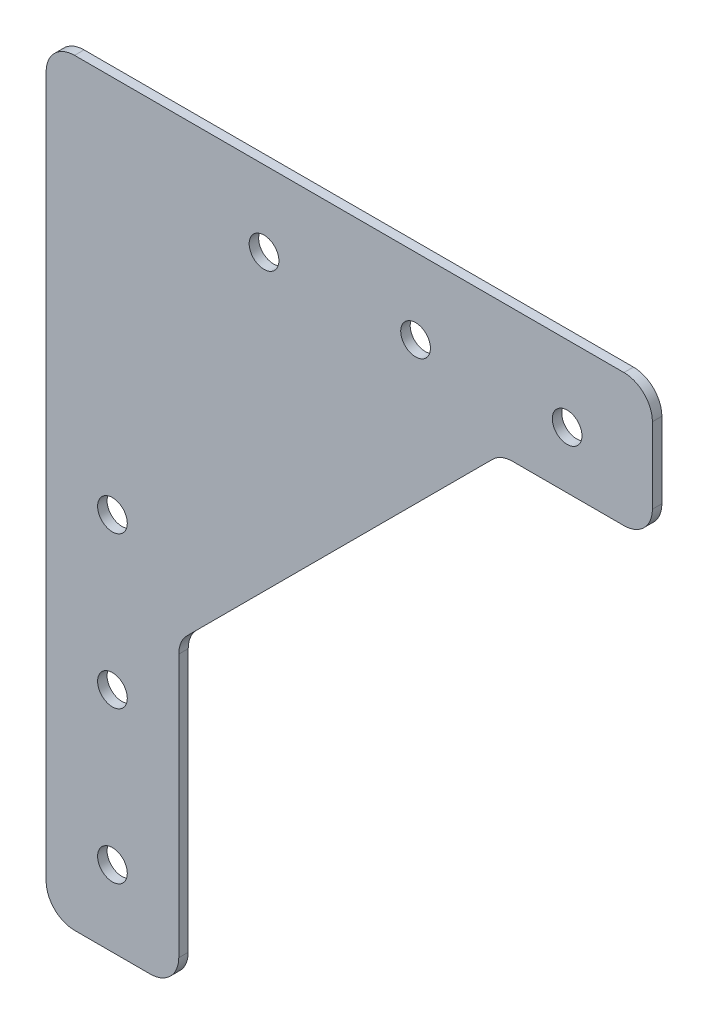
ISO-10303-21;
HEADER;
FILE_DESCRIPTION(('STEP AP214'),'2;1');
FILE_NAME('part.step','',(''),(''),'','','');
FILE_SCHEMA(('AUTOMOTIVE_DESIGN { 1 0 10303 214 1 1 1 1 }'));
ENDSEC;
DATA;
#1=APPLICATION_CONTEXT('core data for automotive mechanical design processes');
#2=APPLICATION_PROTOCOL_DEFINITION('international standard','automotive_design',2000,#1);
#3=PRODUCT_CONTEXT('',#1,'mechanical');
#4=PRODUCT('Part','Part','',(#3));
#5=PRODUCT_RELATED_PRODUCT_CATEGORY('part','',(#4));
#6=PRODUCT_DEFINITION_FORMATION('','',#4);
#7=PRODUCT_DEFINITION_CONTEXT('part definition',#1,'design');
#8=PRODUCT_DEFINITION('design','',#6,#7);
#9=PRODUCT_DEFINITION_SHAPE('','',#8);
#10=(LENGTH_UNIT() NAMED_UNIT(*) SI_UNIT(.MILLI.,.METRE.));
#11=(NAMED_UNIT(*) PLANE_ANGLE_UNIT() SI_UNIT($,.RADIAN.));
#12=(NAMED_UNIT(*) SI_UNIT($,.STERADIAN.) SOLID_ANGLE_UNIT());
#13=UNCERTAINTY_MEASURE_WITH_UNIT(LENGTH_MEASURE(1.E-05),#10,'distance_accuracy_value','');
#14=(GEOMETRIC_REPRESENTATION_CONTEXT(3) GLOBAL_UNCERTAINTY_ASSIGNED_CONTEXT((#13)) GLOBAL_UNIT_ASSIGNED_CONTEXT((#10,
#11,#12)) REPRESENTATION_CONTEXT('',''));
#15=CARTESIAN_POINT('',(0.,0.,0.));
#16=DIRECTION('',(0.,0.,1.));
#17=DIRECTION('',(1.,0.,0.));
#18=AXIS2_PLACEMENT_3D('',#15,#16,#17);
#19=CARTESIAN_POINT('',(0.,0.,0.79375));
#20=DIRECTION('',(0.,0.,-1.));
#21=DIRECTION('',(-1.,0.,0.));
#22=AXIS2_PLACEMENT_3D('',#19,#20,#21);
#23=PLANE('',#22);
#24=DIRECTION('',(0.,1.,0.));
#25=VECTOR('',#24,1.);
#26=CARTESIAN_POINT('',(0.,0.,0.79375));
#27=LINE('',#26,#25);
#28=CARTESIAN_POINT('',(0.,4.7625,0.79375));
#29=VERTEX_POINT('',#28);
#30=CARTESIAN_POINT('',(0.,122.2375,0.79375));
#31=VERTEX_POINT('',#30);
#32=EDGE_CURVE('E423',#29,#31,#27,.T.);
#33=ORIENTED_EDGE('',*,*,#32,.F.);
#34=CARTESIAN_POINT('',(4.7625,4.7625,0.79375));
#35=DIRECTION('',(0.,0.,-1.));
#36=DIRECTION('',(-1.,0.,0.));
#37=AXIS2_PLACEMENT_3D('',#34,#35,#36);
#38=CIRCLE('',#37,4.7625);
#39=CARTESIAN_POINT('',(4.7625,0.,0.79375));
#40=VERTEX_POINT('',#39);
#41=EDGE_CURVE('E340',#29,#40,#38,.F.);
#42=ORIENTED_EDGE('',*,*,#41,.T.);
#43=DIRECTION('',(-1.,0.,0.));
#44=VECTOR('',#43,1.);
#45=CARTESIAN_POINT('',(22.225,0.,0.79375));
#46=LINE('',#45,#44);
#47=CARTESIAN_POINT('',(17.4625,0.,0.79375));
#48=VERTEX_POINT('',#47);
#49=EDGE_CURVE('E377',#48,#40,#46,.T.);
#50=ORIENTED_EDGE('',*,*,#49,.F.);
#51=CARTESIAN_POINT('',(17.4625,4.7625,0.79375));
#52=DIRECTION('',(0.,0.,-1.));
#53=DIRECTION('',(-1.,0.,0.));
#54=AXIS2_PLACEMENT_3D('',#51,#52,#53);
#55=CIRCLE('',#54,4.7625);
#56=CARTESIAN_POINT('',(22.225,4.7625,0.79375));
#57=VERTEX_POINT('',#56);
#58=EDGE_CURVE('E313',#48,#57,#55,.F.);
#59=ORIENTED_EDGE('',*,*,#58,.T.);
#60=DIRECTION('',(0.,1.,0.));
#61=VECTOR('',#60,1.);
#62=CARTESIAN_POINT('',(22.225,0.,0.79375));
#63=LINE('',#62,#61);
#64=CARTESIAN_POINT('',(22.225,48.8273079091979,0.79375));
#65=VERTEX_POINT('',#64);
#66=EDGE_CURVE('E314',#57,#65,#63,.T.);
#67=ORIENTED_EDGE('',*,*,#66,.T.);
#68=CARTESIAN_POINT('',(26.9875,48.8273079091979,0.79375));
#69=DIRECTION('',(0.,0.,-1.));
#70=DIRECTION('',(-1.,0.,0.));
#71=AXIS2_PLACEMENT_3D('',#68,#69,#70);
#72=CIRCLE('',#71,4.7625);
#73=CARTESIAN_POINT('',(23.6199039545991,52.1949039545989,0.79375));
#74=VERTEX_POINT('',#73);
#75=EDGE_CURVE('E12',#65,#74,#72,.T.);
#76=ORIENTED_EDGE('',*,*,#75,.T.);
#77=DIRECTION('',(0.707106781186546,0.707106781186549,0.));
#78=VECTOR('',#77,1.);
#79=CARTESIAN_POINT('',(22.225,50.7999999999998,0.79375));
#80=LINE('',#79,#78);
#81=CARTESIAN_POINT('',(74.8050960454009,103.380096045401,0.79375));
#82=VERTEX_POINT('',#81);
#83=EDGE_CURVE('E318',#74,#82,#80,.T.);
#84=ORIENTED_EDGE('',*,*,#83,.T.);
#85=CARTESIAN_POINT('',(78.1726920908019,100.0125,0.79375));
#86=DIRECTION('',(0.,0.,-1.));
#87=DIRECTION('',(-1.,0.,0.));
#88=AXIS2_PLACEMENT_3D('',#85,#86,#87);
#89=CIRCLE('',#88,4.7625);
#90=CARTESIAN_POINT('',(78.1726920908019,104.775,0.79375));
#91=VERTEX_POINT('',#90);
#92=EDGE_CURVE('E367',#82,#91,#89,.T.);
#93=ORIENTED_EDGE('',*,*,#92,.T.);
#94=DIRECTION('',(1.,0.,0.));
#95=VECTOR('',#94,1.);
#96=CARTESIAN_POINT('',(76.2,104.775,0.79375));
#97=LINE('',#96,#95);
#98=CARTESIAN_POINT('',(96.8375,104.775,0.79375));
#99=VERTEX_POINT('',#98);
#100=EDGE_CURVE('E388',#91,#99,#97,.T.);
#101=ORIENTED_EDGE('',*,*,#100,.T.);
#102=CARTESIAN_POINT('',(96.8375,109.5375,0.79375));
#103=DIRECTION('',(0.,0.,-1.));
#104=DIRECTION('',(-1.,0.,0.));
#105=AXIS2_PLACEMENT_3D('',#102,#103,#104);
#106=CIRCLE('',#105,4.7625);
#107=CARTESIAN_POINT('',(101.6,109.5375,0.79375));
#108=VERTEX_POINT('',#107);
#109=EDGE_CURVE('E336',#99,#108,#106,.F.);
#110=ORIENTED_EDGE('',*,*,#109,.T.);
#111=DIRECTION('',(0.,-1.,0.));
#112=VECTOR('',#111,1.);
#113=CARTESIAN_POINT('',(101.6,127.,0.79375));
#114=LINE('',#113,#112);
#115=CARTESIAN_POINT('',(101.6,122.2375,0.79375));
#116=VERTEX_POINT('',#115);
#117=EDGE_CURVE('E391',#116,#108,#114,.T.);
#118=ORIENTED_EDGE('',*,*,#117,.F.);
#119=CARTESIAN_POINT('',(96.8375,122.2375,0.79375));
#120=DIRECTION('',(0.,0.,-1.));
#121=DIRECTION('',(-1.,0.,0.));
#122=AXIS2_PLACEMENT_3D('',#119,#120,#121);
#123=CIRCLE('',#122,4.7625);
#124=CARTESIAN_POINT('',(96.8375,127.,0.79375));
#125=VERTEX_POINT('',#124);
#126=EDGE_CURVE('E199',#116,#125,#123,.F.);
#127=ORIENTED_EDGE('',*,*,#126,.T.);
#128=DIRECTION('',(1.,0.,0.));
#129=VECTOR('',#128,1.);
#130=CARTESIAN_POINT('',(0.,127.,0.79375));
#131=LINE('',#130,#129);
#132=CARTESIAN_POINT('',(4.7625,127.,0.79375));
#133=VERTEX_POINT('',#132);
#134=EDGE_CURVE('E422',#133,#125,#131,.T.);
#135=ORIENTED_EDGE('',*,*,#134,.F.);
#136=CARTESIAN_POINT('',(4.7625,122.2375,0.79375));
#137=DIRECTION('',(0.,0.,-1.));
#138=DIRECTION('',(-1.,0.,0.));
#139=AXIS2_PLACEMENT_3D('',#136,#137,#138);
#140=CIRCLE('',#139,4.7625);
#141=EDGE_CURVE('E338',#133,#31,#140,.F.);
#142=ORIENTED_EDGE('',*,*,#141,.T.);
#143=EDGE_LOOP('',(#33,#42,#50,#59,#67,#76,#84,#93,#101,#110,#118,#127,#135,#142));
#144=FACE_BOUND('',#143,.T.);
#145=CARTESIAN_POINT('',(11.1124999999995,63.5,0.79375));
#146=DIRECTION('',(0.,0.,1.));
#147=DIRECTION('',(1.,0.,0.));
#148=AXIS2_PLACEMENT_3D('',#145,#146,#147);
#149=CIRCLE('',#148,2.48919999999999);
#150=CARTESIAN_POINT('',(13.6016999999995,63.5,0.79375));
#151=VERTEX_POINT('',#150);
#152=EDGE_CURVE('E309',#151,#151,#149,.T.);
#153=ORIENTED_EDGE('',*,*,#152,.F.);
#154=EDGE_LOOP('',(#153));
#155=FACE_BOUND('',#154,.T.);
#156=CARTESIAN_POINT('',(11.1125,12.7,0.79375));
#157=DIRECTION('',(0.,0.,1.));
#158=DIRECTION('',(1.,0.,0.));
#159=AXIS2_PLACEMENT_3D('',#156,#157,#158);
#160=CIRCLE('',#159,2.4892);
#161=CARTESIAN_POINT('',(13.6017,12.7,0.79375));
#162=VERTEX_POINT('',#161);
#163=EDGE_CURVE('E432',#162,#162,#160,.T.);
#164=ORIENTED_EDGE('',*,*,#163,.F.);
#165=EDGE_LOOP('',(#164));
#166=FACE_BOUND('',#165,.T.);
#167=CARTESIAN_POINT('',(87.3125,114.3,0.79375));
#168=DIRECTION('',(0.,0.,1.));
#169=DIRECTION('',(1.,0.,0.));
#170=AXIS2_PLACEMENT_3D('',#167,#168,#169);
#171=CIRCLE('',#170,2.48920000000001);
#172=CARTESIAN_POINT('',(89.8017,114.3,0.79375));
#173=VERTEX_POINT('',#172);
#174=EDGE_CURVE('E438',#173,#173,#171,.T.);
#175=ORIENTED_EDGE('',*,*,#174,.F.);
#176=EDGE_LOOP('',(#175));
#177=FACE_BOUND('',#176,.T.);
#178=CARTESIAN_POINT('',(11.1124999999997,38.1,0.79375));
#179=DIRECTION('',(0.,0.,1.));
#180=DIRECTION('',(1.,0.,0.));
#181=AXIS2_PLACEMENT_3D('',#178,#179,#180);
#182=CIRCLE('',#181,2.4892);
#183=CARTESIAN_POINT('',(13.6016999999997,38.1,0.79375));
#184=VERTEX_POINT('',#183);
#185=EDGE_CURVE('E444',#184,#184,#182,.T.);
#186=ORIENTED_EDGE('',*,*,#185,.F.);
#187=EDGE_LOOP('',(#186));
#188=FACE_BOUND('',#187,.T.);
#189=CARTESIAN_POINT('',(61.9125,114.3,0.79375));
#190=DIRECTION('',(0.,0.,1.));
#191=DIRECTION('',(1.,0.,0.));
#192=AXIS2_PLACEMENT_3D('',#189,#190,#191);
#193=CIRCLE('',#192,2.4892);
#194=CARTESIAN_POINT('',(64.4017,114.3,0.79375));
#195=VERTEX_POINT('',#194);
#196=EDGE_CURVE('E450',#195,#195,#193,.T.);
#197=ORIENTED_EDGE('',*,*,#196,.F.);
#198=EDGE_LOOP('',(#197));
#199=FACE_BOUND('',#198,.T.);
#200=CARTESIAN_POINT('',(36.5125,114.3,0.79375));
#201=DIRECTION('',(0.,0.,1.));
#202=DIRECTION('',(1.,0.,0.));
#203=AXIS2_PLACEMENT_3D('',#200,#201,#202);
#204=CIRCLE('',#203,2.4892);
#205=CARTESIAN_POINT('',(39.0017,114.3,0.79375));
#206=VERTEX_POINT('',#205);
#207=EDGE_CURVE('E456',#206,#206,#204,.T.);
#208=ORIENTED_EDGE('',*,*,#207,.F.);
#209=EDGE_LOOP('',(#208));
#210=FACE_BOUND('',#209,.T.);
#211=ADVANCED_FACE('F184',(#144,#155,#166,#177,#188,#199,#210),#23,.F.);
#212=CARTESIAN_POINT('',(0.,0.,-0.79375));
#213=DIRECTION('',(0.,0.,-1.));
#214=DIRECTION('',(-1.,0.,0.));
#215=AXIS2_PLACEMENT_3D('',#212,#213,#214);
#216=PLANE('',#215);
#217=CARTESIAN_POINT('',(61.9125,114.3,-0.79375));
#218=DIRECTION('',(0.,0.,1.));
#219=DIRECTION('',(1.,0.,0.));
#220=AXIS2_PLACEMENT_3D('',#217,#218,#219);
#221=CIRCLE('',#220,2.4892);
#222=CARTESIAN_POINT('',(64.4017,114.3,-0.79375));
#223=VERTEX_POINT('',#222);
#224=EDGE_CURVE('E453',#223,#223,#221,.T.);
#225=ORIENTED_EDGE('',*,*,#224,.T.);
#226=EDGE_LOOP('',(#225));
#227=FACE_BOUND('',#226,.T.);
#228=CARTESIAN_POINT('',(87.3125,114.3,-0.79375));
#229=DIRECTION('',(0.,0.,1.));
#230=DIRECTION('',(1.,0.,0.));
#231=AXIS2_PLACEMENT_3D('',#228,#229,#230);
#232=CIRCLE('',#231,2.48920000000001);
#233=CARTESIAN_POINT('',(89.8017,114.3,-0.79375));
#234=VERTEX_POINT('',#233);
#235=EDGE_CURVE('E441',#234,#234,#232,.T.);
#236=ORIENTED_EDGE('',*,*,#235,.T.);
#237=EDGE_LOOP('',(#236));
#238=FACE_BOUND('',#237,.T.);
#239=CARTESIAN_POINT('',(11.1124999999995,63.5,-0.79375));
#240=DIRECTION('',(0.,0.,1.));
#241=DIRECTION('',(1.,0.,0.));
#242=AXIS2_PLACEMENT_3D('',#239,#240,#241);
#243=CIRCLE('',#242,2.48919999999999);
#244=CARTESIAN_POINT('',(13.6016999999995,63.5,-0.79375));
#245=VERTEX_POINT('',#244);
#246=EDGE_CURVE('E429',#245,#245,#243,.T.);
#247=ORIENTED_EDGE('',*,*,#246,.T.);
#248=EDGE_LOOP('',(#247));
#249=FACE_BOUND('',#248,.T.);
#250=DIRECTION('',(-1.,0.,0.));
#251=VECTOR('',#250,1.);
#252=CARTESIAN_POINT('',(22.225,0.,-0.79375));
#253=LINE('',#252,#251);
#254=CARTESIAN_POINT('',(17.4625,0.,-0.79375));
#255=VERTEX_POINT('',#254);
#256=CARTESIAN_POINT('',(4.7625,0.,-0.79375));
#257=VERTEX_POINT('',#256);
#258=EDGE_CURVE('E290',#255,#257,#253,.T.);
#259=ORIENTED_EDGE('',*,*,#258,.T.);
#260=CARTESIAN_POINT('',(4.7625,4.7625,-0.79375));
#261=DIRECTION('',(0.,0.,-1.));
#262=DIRECTION('',(-1.,0.,0.));
#263=AXIS2_PLACEMENT_3D('',#260,#261,#262);
#264=CIRCLE('',#263,4.7625);
#265=CARTESIAN_POINT('',(0.,4.7625,-0.79375));
#266=VERTEX_POINT('',#265);
#267=EDGE_CURVE('E327',#257,#266,#264,.T.);
#268=ORIENTED_EDGE('',*,*,#267,.T.);
#269=DIRECTION('',(0.,1.,0.));
#270=VECTOR('',#269,1.);
#271=CARTESIAN_POINT('',(0.,0.,-0.79375));
#272=LINE('',#271,#270);
#273=CARTESIAN_POINT('',(0.,122.2375,-0.79375));
#274=VERTEX_POINT('',#273);
#275=EDGE_CURVE('E308',#266,#274,#272,.T.);
#276=ORIENTED_EDGE('',*,*,#275,.T.);
#277=CARTESIAN_POINT('',(4.7625,122.2375,-0.79375));
#278=DIRECTION('',(0.,0.,-1.));
#279=DIRECTION('',(-1.,0.,0.));
#280=AXIS2_PLACEMENT_3D('',#277,#278,#279);
#281=CIRCLE('',#280,4.7625);
#282=CARTESIAN_POINT('',(4.7625,127.,-0.79375));
#283=VERTEX_POINT('',#282);
#284=EDGE_CURVE('E325',#274,#283,#281,.T.);
#285=ORIENTED_EDGE('',*,*,#284,.T.);
#286=DIRECTION('',(1.,0.,0.));
#287=VECTOR('',#286,1.);
#288=CARTESIAN_POINT('',(0.,127.,-0.79375));
#289=LINE('',#288,#287);
#290=CARTESIAN_POINT('',(96.8375,127.,-0.79375));
#291=VERTEX_POINT('',#290);
#292=EDGE_CURVE('E397',#283,#291,#289,.T.);
#293=ORIENTED_EDGE('',*,*,#292,.T.);
#294=CARTESIAN_POINT('',(96.8375,122.2375,-0.79375));
#295=DIRECTION('',(0.,0.,-1.));
#296=DIRECTION('',(-1.,0.,0.));
#297=AXIS2_PLACEMENT_3D('',#294,#295,#296);
#298=CIRCLE('',#297,4.7625);
#299=CARTESIAN_POINT('',(101.6,122.2375,-0.79375));
#300=VERTEX_POINT('',#299);
#301=EDGE_CURVE('E298',#291,#300,#298,.T.);
#302=ORIENTED_EDGE('',*,*,#301,.T.);
#303=DIRECTION('',(0.,-1.,0.));
#304=VECTOR('',#303,1.);
#305=CARTESIAN_POINT('',(101.6,127.,-0.79375));
#306=LINE('',#305,#304);
#307=CARTESIAN_POINT('',(101.6,109.5375,-0.79375));
#308=VERTEX_POINT('',#307);
#309=EDGE_CURVE('E400',#300,#308,#306,.T.);
#310=ORIENTED_EDGE('',*,*,#309,.T.);
#311=CARTESIAN_POINT('',(96.8375,109.5375,-0.79375));
#312=DIRECTION('',(0.,0.,-1.));
#313=DIRECTION('',(-1.,0.,0.));
#314=AXIS2_PLACEMENT_3D('',#311,#312,#313);
#315=CIRCLE('',#314,4.7625);
#316=CARTESIAN_POINT('',(96.8375,104.775,-0.79375));
#317=VERTEX_POINT('',#316);
#318=EDGE_CURVE('E297',#308,#317,#315,.T.);
#319=ORIENTED_EDGE('',*,*,#318,.T.);
#320=DIRECTION('',(1.,0.,0.));
#321=VECTOR('',#320,1.);
#322=CARTESIAN_POINT('',(76.2,104.775,-0.79375));
#323=LINE('',#322,#321);
#324=CARTESIAN_POINT('',(78.1726920908019,104.775,-0.79375));
#325=VERTEX_POINT('',#324);
#326=EDGE_CURVE('E403',#325,#317,#323,.T.);
#327=ORIENTED_EDGE('',*,*,#326,.F.);
#328=CARTESIAN_POINT('',(78.1726920908019,100.0125,-0.79375));
#329=DIRECTION('',(0.,0.,-1.));
#330=DIRECTION('',(-1.,0.,0.));
#331=AXIS2_PLACEMENT_3D('',#328,#329,#330);
#332=CIRCLE('',#331,4.7625);
#333=CARTESIAN_POINT('',(74.8050960454009,103.380096045401,-0.79375));
#334=VERTEX_POINT('',#333);
#335=EDGE_CURVE('E365',#325,#334,#332,.F.);
#336=ORIENTED_EDGE('',*,*,#335,.T.);
#337=DIRECTION('',(0.707106781186546,0.707106781186549,0.));
#338=VECTOR('',#337,1.);
#339=CARTESIAN_POINT('',(22.225,50.7999999999998,-0.79375));
#340=LINE('',#339,#338);
#341=CARTESIAN_POINT('',(23.6199039545991,52.1949039545989,-0.79375));
#342=VERTEX_POINT('',#341);
#343=EDGE_CURVE('E370',#342,#334,#340,.T.);
#344=ORIENTED_EDGE('',*,*,#343,.F.);
#345=CARTESIAN_POINT('',(26.9875,48.8273079091979,-0.79375));
#346=DIRECTION('',(0.,0.,-1.));
#347=DIRECTION('',(-1.,0.,0.));
#348=AXIS2_PLACEMENT_3D('',#345,#346,#347);
#349=CIRCLE('',#348,4.7625);
#350=CARTESIAN_POINT('',(22.225,48.8273079091979,-0.79375));
#351=VERTEX_POINT('',#350);
#352=EDGE_CURVE('E192',#342,#351,#349,.F.);
#353=ORIENTED_EDGE('',*,*,#352,.T.);
#354=DIRECTION('',(0.,1.,0.));
#355=VECTOR('',#354,1.);
#356=CARTESIAN_POINT('',(22.225,0.,-0.79375));
#357=LINE('',#356,#355);
#358=CARTESIAN_POINT('',(22.225,4.7625,-0.79375));
#359=VERTEX_POINT('',#358);
#360=EDGE_CURVE('E292',#359,#351,#357,.T.);
#361=ORIENTED_EDGE('',*,*,#360,.F.);
#362=CARTESIAN_POINT('',(17.4625,4.7625,-0.79375));
#363=DIRECTION('',(0.,0.,-1.));
#364=DIRECTION('',(-1.,0.,0.));
#365=AXIS2_PLACEMENT_3D('',#362,#363,#364);
#366=CIRCLE('',#365,4.7625);
#367=EDGE_CURVE('E286',#359,#255,#366,.T.);
#368=ORIENTED_EDGE('',*,*,#367,.T.);
#369=EDGE_LOOP('',(#259,#268,#276,#285,#293,#302,#310,#319,#327,#336,#344,#353,#361,#368));
#370=FACE_BOUND('',#369,.T.);
#371=CARTESIAN_POINT('',(11.1125,12.7,-0.79375));
#372=DIRECTION('',(0.,0.,1.));
#373=DIRECTION('',(1.,0.,0.));
#374=AXIS2_PLACEMENT_3D('',#371,#372,#373);
#375=CIRCLE('',#374,2.4892);
#376=CARTESIAN_POINT('',(13.6017,12.7,-0.79375));
#377=VERTEX_POINT('',#376);
#378=EDGE_CURVE('E435',#377,#377,#375,.T.);
#379=ORIENTED_EDGE('',*,*,#378,.T.);
#380=EDGE_LOOP('',(#379));
#381=FACE_BOUND('',#380,.T.);
#382=CARTESIAN_POINT('',(11.1124999999997,38.1,-0.79375));
#383=DIRECTION('',(0.,0.,1.));
#384=DIRECTION('',(1.,0.,0.));
#385=AXIS2_PLACEMENT_3D('',#382,#383,#384);
#386=CIRCLE('',#385,2.4892);
#387=CARTESIAN_POINT('',(13.6016999999997,38.1,-0.79375));
#388=VERTEX_POINT('',#387);
#389=EDGE_CURVE('E447',#388,#388,#386,.T.);
#390=ORIENTED_EDGE('',*,*,#389,.T.);
#391=EDGE_LOOP('',(#390));
#392=FACE_BOUND('',#391,.T.);
#393=CARTESIAN_POINT('',(36.5125,114.3,-0.79375));
#394=DIRECTION('',(0.,0.,1.));
#395=DIRECTION('',(1.,0.,0.));
#396=AXIS2_PLACEMENT_3D('',#393,#394,#395);
#397=CIRCLE('',#396,2.4892);
#398=CARTESIAN_POINT('',(39.0017,114.3,-0.79375));
#399=VERTEX_POINT('',#398);
#400=EDGE_CURVE('E459',#399,#399,#397,.T.);
#401=ORIENTED_EDGE('',*,*,#400,.T.);
#402=EDGE_LOOP('',(#401));
#403=FACE_BOUND('',#402,.T.);
#404=ADVANCED_FACE('F288',(#227,#238,#249,#370,#381,#392,#403),#216,.T.);
#405=CARTESIAN_POINT('',(22.225,0.,0.79375));
#406=DIRECTION('',(0.,-1.,0.));
#407=DIRECTION('',(0.,0.,-1.));
#408=AXIS2_PLACEMENT_3D('',#405,#406,#407);
#409=PLANE('',#408);
#410=ORIENTED_EDGE('',*,*,#49,.T.);
#411=DIRECTION('',(0.,0.,-1.));
#412=VECTOR('',#411,1.);
#413=CARTESIAN_POINT('',(4.7625,0.,0.79375));
#414=LINE('',#413,#412);
#415=EDGE_CURVE('E307',#40,#257,#414,.T.);
#416=ORIENTED_EDGE('',*,*,#415,.T.);
#417=ORIENTED_EDGE('',*,*,#258,.F.);
#418=DIRECTION('',(0.,0.,-1.));
#419=VECTOR('',#418,1.);
#420=CARTESIAN_POINT('',(17.4625,0.,0.79375));
#421=LINE('',#420,#419);
#422=EDGE_CURVE('E304',#255,#48,#421,.F.);
#423=ORIENTED_EDGE('',*,*,#422,.T.);
#424=EDGE_LOOP('',(#410,#416,#417,#423));
#425=FACE_BOUND('',#424,.T.);
#426=ADVANCED_FACE('F303',(#425),#409,.T.);
#427=CARTESIAN_POINT('',(22.225,0.,0.79375));
#428=DIRECTION('',(-1.,0.,0.));
#429=DIRECTION('',(0.,0.,1.));
#430=AXIS2_PLACEMENT_3D('',#427,#428,#429);
#431=PLANE('',#430);
#432=ORIENTED_EDGE('',*,*,#360,.T.);
#433=DIRECTION('',(0.,0.,-1.));
#434=VECTOR('',#433,1.);
#435=CARTESIAN_POINT('',(22.225,48.8273079091979,0.79375));
#436=LINE('',#435,#434);
#437=EDGE_CURVE('E363',#351,#65,#436,.F.);
#438=ORIENTED_EDGE('',*,*,#437,.T.);
#439=ORIENTED_EDGE('',*,*,#66,.F.);
#440=DIRECTION('',(0.,0.,-1.));
#441=VECTOR('',#440,1.);
#442=CARTESIAN_POINT('',(22.225,4.7625,-0.79375));
#443=LINE('',#442,#441);
#444=EDGE_CURVE('E361',#57,#359,#443,.T.);
#445=ORIENTED_EDGE('',*,*,#444,.T.);
#446=EDGE_LOOP('',(#432,#438,#439,#445));
#447=FACE_BOUND('',#446,.T.);
#448=ADVANCED_FACE('F375',(#447),#431,.F.);
#449=CARTESIAN_POINT('',(22.225,50.7999999999998,0.79375));
#450=DIRECTION('',(-0.707106781186549,0.707106781186546,0.));
#451=DIRECTION('',(-0.707106781186546,-0.707106781186549,0.));
#452=AXIS2_PLACEMENT_3D('',#449,#450,#451);
#453=PLANE('',#452);
#454=ORIENTED_EDGE('',*,*,#343,.T.);
#455=DIRECTION('',(0.,0.,-1.));
#456=VECTOR('',#455,1.);
#457=CARTESIAN_POINT('',(74.8050960454009,103.380096045401,0.79375));
#458=LINE('',#457,#456);
#459=EDGE_CURVE('E359',#334,#82,#458,.F.);
#460=ORIENTED_EDGE('',*,*,#459,.T.);
#461=ORIENTED_EDGE('',*,*,#83,.F.);
#462=DIRECTION('',(0.,0.,-1.));
#463=VECTOR('',#462,1.);
#464=CARTESIAN_POINT('',(23.6199039545991,52.1949039545989,-0.79375));
#465=LINE('',#464,#463);
#466=EDGE_CURVE('E356',#74,#342,#465,.T.);
#467=ORIENTED_EDGE('',*,*,#466,.T.);
#468=EDGE_LOOP('',(#454,#460,#461,#467));
#469=FACE_BOUND('',#468,.T.);
#470=ADVANCED_FACE('F386',(#469),#453,.F.);
#471=CARTESIAN_POINT('',(76.2,104.775,0.79375));
#472=DIRECTION('',(0.,1.,0.));
#473=DIRECTION('',(0.,0.,1.));
#474=AXIS2_PLACEMENT_3D('',#471,#472,#473);
#475=PLANE('',#474);
#476=ORIENTED_EDGE('',*,*,#326,.T.);
#477=DIRECTION('',(0.,0.,-1.));
#478=VECTOR('',#477,1.);
#479=CARTESIAN_POINT('',(96.8375,104.775,0.79375));
#480=LINE('',#479,#478);
#481=EDGE_CURVE('E354',#317,#99,#480,.F.);
#482=ORIENTED_EDGE('',*,*,#481,.T.);
#483=ORIENTED_EDGE('',*,*,#100,.F.);
#484=DIRECTION('',(0.,0.,-1.));
#485=VECTOR('',#484,1.);
#486=CARTESIAN_POINT('',(78.1726920908019,104.775,-0.79375));
#487=LINE('',#486,#485);
#488=EDGE_CURVE('E351',#91,#325,#487,.T.);
#489=ORIENTED_EDGE('',*,*,#488,.T.);
#490=EDGE_LOOP('',(#476,#482,#483,#489));
#491=FACE_BOUND('',#490,.T.);
#492=ADVANCED_FACE('F411',(#491),#475,.F.);
#493=CARTESIAN_POINT('',(101.6,127.,0.79375));
#494=DIRECTION('',(1.,0.,0.));
#495=DIRECTION('',(0.,0.,-1.));
#496=AXIS2_PLACEMENT_3D('',#493,#494,#495);
#497=PLANE('',#496);
#498=ORIENTED_EDGE('',*,*,#117,.T.);
#499=DIRECTION('',(0.,0.,-1.));
#500=VECTOR('',#499,1.);
#501=CARTESIAN_POINT('',(101.6,109.5375,-0.79375));
#502=LINE('',#501,#500);
#503=EDGE_CURVE('E348',#108,#308,#502,.T.);
#504=ORIENTED_EDGE('',*,*,#503,.T.);
#505=ORIENTED_EDGE('',*,*,#309,.F.);
#506=DIRECTION('',(0.,0.,-1.));
#507=VECTOR('',#506,1.);
#508=CARTESIAN_POINT('',(101.6,122.2375,0.79375));
#509=LINE('',#508,#507);
#510=EDGE_CURVE('E346',#300,#116,#509,.F.);
#511=ORIENTED_EDGE('',*,*,#510,.T.);
#512=EDGE_LOOP('',(#498,#504,#505,#511));
#513=FACE_BOUND('',#512,.T.);
#514=ADVANCED_FACE('F419',(#513),#497,.T.);
#515=CARTESIAN_POINT('',(0.,127.,0.79375));
#516=DIRECTION('',(0.,1.,0.));
#517=DIRECTION('',(0.,0.,1.));
#518=AXIS2_PLACEMENT_3D('',#515,#516,#517);
#519=PLANE('',#518);
#520=ORIENTED_EDGE('',*,*,#292,.F.);
#521=DIRECTION('',(0.,0.,-1.));
#522=VECTOR('',#521,1.);
#523=CARTESIAN_POINT('',(4.7625,127.,0.79375));
#524=LINE('',#523,#522);
#525=EDGE_CURVE('E206',#283,#133,#524,.F.);
#526=ORIENTED_EDGE('',*,*,#525,.T.);
#527=ORIENTED_EDGE('',*,*,#134,.T.);
#528=DIRECTION('',(0.,0.,-1.));
#529=VECTOR('',#528,1.);
#530=CARTESIAN_POINT('',(96.8375,127.,0.79375));
#531=LINE('',#530,#529);
#532=EDGE_CURVE('E342',#125,#291,#531,.T.);
#533=ORIENTED_EDGE('',*,*,#532,.T.);
#534=EDGE_LOOP('',(#520,#526,#527,#533));
#535=FACE_BOUND('',#534,.T.);
#536=ADVANCED_FACE('F487',(#535),#519,.T.);
#537=CARTESIAN_POINT('',(0.,0.,0.79375));
#538=DIRECTION('',(-1.,0.,0.));
#539=DIRECTION('',(0.,0.,1.));
#540=AXIS2_PLACEMENT_3D('',#537,#538,#539);
#541=PLANE('',#540);
#542=ORIENTED_EDGE('',*,*,#275,.F.);
#543=DIRECTION('',(0.,0.,-1.));
#544=VECTOR('',#543,1.);
#545=CARTESIAN_POINT('',(0.,4.7625,0.79375));
#546=LINE('',#545,#544);
#547=EDGE_CURVE('E332',#266,#29,#546,.F.);
#548=ORIENTED_EDGE('',*,*,#547,.T.);
#549=ORIENTED_EDGE('',*,*,#32,.T.);
#550=DIRECTION('',(0.,0.,-1.));
#551=VECTOR('',#550,1.);
#552=CARTESIAN_POINT('',(0.,122.2375,0.79375));
#553=LINE('',#552,#551);
#554=EDGE_CURVE('E329',#31,#274,#553,.T.);
#555=ORIENTED_EDGE('',*,*,#554,.T.);
#556=EDGE_LOOP('',(#542,#548,#549,#555));
#557=FACE_BOUND('',#556,.T.);
#558=ADVANCED_FACE('F490',(#557),#541,.T.);
#559=CARTESIAN_POINT('',(11.1124999999995,63.5,0.79375));
#560=DIRECTION('',(0.,0.,-1.));
#561=DIRECTION('',(-1.,0.,0.));
#562=AXIS2_PLACEMENT_3D('',#559,#560,#561);
#563=CYLINDRICAL_SURFACE('',#562,2.48919999999999);
#564=ORIENTED_EDGE('',*,*,#152,.T.);
#565=EDGE_LOOP('',(#564));
#566=FACE_BOUND('',#565,.T.);
#567=ORIENTED_EDGE('',*,*,#246,.F.);
#568=EDGE_LOOP('',(#567));
#569=FACE_BOUND('',#568,.T.);
#570=ADVANCED_FACE('F476',(#566,#569),#563,.F.);
#571=CARTESIAN_POINT('',(11.1125,12.7,0.79375));
#572=DIRECTION('',(0.,0.,-1.));
#573=DIRECTION('',(-1.,0.,0.));
#574=AXIS2_PLACEMENT_3D('',#571,#572,#573);
#575=CYLINDRICAL_SURFACE('',#574,2.4892);
#576=ORIENTED_EDGE('',*,*,#163,.T.);
#577=EDGE_LOOP('',(#576));
#578=FACE_BOUND('',#577,.T.);
#579=ORIENTED_EDGE('',*,*,#378,.F.);
#580=EDGE_LOOP('',(#579));
#581=FACE_BOUND('',#580,.T.);
#582=ADVANCED_FACE('F668',(#578,#581),#575,.F.);
#583=CARTESIAN_POINT('',(87.3125,114.3,0.79375));
#584=DIRECTION('',(0.,0.,-1.));
#585=DIRECTION('',(-1.,0.,0.));
#586=AXIS2_PLACEMENT_3D('',#583,#584,#585);
#587=CYLINDRICAL_SURFACE('',#586,2.48920000000001);
#588=ORIENTED_EDGE('',*,*,#174,.T.);
#589=EDGE_LOOP('',(#588));
#590=FACE_BOUND('',#589,.T.);
#591=ORIENTED_EDGE('',*,*,#235,.F.);
#592=EDGE_LOOP('',(#591));
#593=FACE_BOUND('',#592,.T.);
#594=ADVANCED_FACE('F657',(#590,#593),#587,.F.);
#595=CARTESIAN_POINT('',(11.1124999999997,38.1,0.79375));
#596=DIRECTION('',(0.,0.,-1.));
#597=DIRECTION('',(-1.,0.,0.));
#598=AXIS2_PLACEMENT_3D('',#595,#596,#597);
#599=CYLINDRICAL_SURFACE('',#598,2.4892);
#600=ORIENTED_EDGE('',*,*,#185,.T.);
#601=EDGE_LOOP('',(#600));
#602=FACE_BOUND('',#601,.T.);
#603=ORIENTED_EDGE('',*,*,#389,.F.);
#604=EDGE_LOOP('',(#603));
#605=FACE_BOUND('',#604,.T.);
#606=ADVANCED_FACE('F646',(#602,#605),#599,.F.);
#607=CARTESIAN_POINT('',(61.9125,114.3,0.79375));
#608=DIRECTION('',(0.,0.,-1.));
#609=DIRECTION('',(-1.,0.,0.));
#610=AXIS2_PLACEMENT_3D('',#607,#608,#609);
#611=CYLINDRICAL_SURFACE('',#610,2.4892);
#612=ORIENTED_EDGE('',*,*,#196,.T.);
#613=EDGE_LOOP('',(#612));
#614=FACE_BOUND('',#613,.T.);
#615=ORIENTED_EDGE('',*,*,#224,.F.);
#616=EDGE_LOOP('',(#615));
#617=FACE_BOUND('',#616,.T.);
#618=ADVANCED_FACE('F636',(#614,#617),#611,.F.);
#619=CARTESIAN_POINT('',(36.5125,114.3,0.79375));
#620=DIRECTION('',(0.,0.,-1.));
#621=DIRECTION('',(-1.,0.,0.));
#622=AXIS2_PLACEMENT_3D('',#619,#620,#621);
#623=CYLINDRICAL_SURFACE('',#622,2.4892);
#624=ORIENTED_EDGE('',*,*,#207,.T.);
#625=EDGE_LOOP('',(#624));
#626=FACE_BOUND('',#625,.T.);
#627=ORIENTED_EDGE('',*,*,#400,.F.);
#628=EDGE_LOOP('',(#627));
#629=FACE_BOUND('',#628,.T.);
#630=ADVANCED_FACE('F465',(#626,#629),#623,.F.);
#631=CARTESIAN_POINT('',(4.7625,4.7625,0.79375));
#632=DIRECTION('',(0.,0.,-1.));
#633=DIRECTION('',(-1.,0.,0.));
#634=AXIS2_PLACEMENT_3D('',#631,#632,#633);
#635=CYLINDRICAL_SURFACE('',#634,4.7625);
#636=ORIENTED_EDGE('',*,*,#41,.F.);
#637=ORIENTED_EDGE('',*,*,#547,.F.);
#638=ORIENTED_EDGE('',*,*,#267,.F.);
#639=ORIENTED_EDGE('',*,*,#415,.F.);
#640=EDGE_LOOP('',(#636,#637,#638,#639));
#641=FACE_BOUND('',#640,.T.);
#642=ADVANCED_FACE('F496',(#641),#635,.T.);
#643=CARTESIAN_POINT('',(4.7625,122.2375,0.79375));
#644=DIRECTION('',(0.,0.,-1.));
#645=DIRECTION('',(-1.,0.,0.));
#646=AXIS2_PLACEMENT_3D('',#643,#644,#645);
#647=CYLINDRICAL_SURFACE('',#646,4.7625);
#648=ORIENTED_EDGE('',*,*,#141,.F.);
#649=ORIENTED_EDGE('',*,*,#525,.F.);
#650=ORIENTED_EDGE('',*,*,#284,.F.);
#651=ORIENTED_EDGE('',*,*,#554,.F.);
#652=EDGE_LOOP('',(#648,#649,#650,#651));
#653=FACE_BOUND('',#652,.T.);
#654=ADVANCED_FACE('F499',(#653),#647,.T.);
#655=CARTESIAN_POINT('',(96.8375,109.5375,0.79375));
#656=DIRECTION('',(0.,0.,1.));
#657=DIRECTION('',(1.,0.,0.));
#658=AXIS2_PLACEMENT_3D('',#655,#656,#657);
#659=CYLINDRICAL_SURFACE('',#658,4.7625);
#660=ORIENTED_EDGE('',*,*,#109,.F.);
#661=ORIENTED_EDGE('',*,*,#481,.F.);
#662=ORIENTED_EDGE('',*,*,#318,.F.);
#663=ORIENTED_EDGE('',*,*,#503,.F.);
#664=EDGE_LOOP('',(#660,#661,#662,#663));
#665=FACE_BOUND('',#664,.T.);
#666=ADVANCED_FACE('F415',(#665),#659,.T.);
#667=CARTESIAN_POINT('',(78.1726920908019,100.0125,0.79375));
#668=DIRECTION('',(0.,0.,1.));
#669=DIRECTION('',(1.,0.,0.));
#670=AXIS2_PLACEMENT_3D('',#667,#668,#669);
#671=CYLINDRICAL_SURFACE('',#670,4.7625);
#672=ORIENTED_EDGE('',*,*,#92,.F.);
#673=ORIENTED_EDGE('',*,*,#459,.F.);
#674=ORIENTED_EDGE('',*,*,#335,.F.);
#675=ORIENTED_EDGE('',*,*,#488,.F.);
#676=EDGE_LOOP('',(#672,#673,#674,#675));
#677=FACE_BOUND('',#676,.T.);
#678=ADVANCED_FACE('F406',(#677),#671,.F.);
#679=CARTESIAN_POINT('',(26.9875,48.8273079091979,0.79375));
#680=DIRECTION('',(0.,0.,1.));
#681=DIRECTION('',(1.,0.,0.));
#682=AXIS2_PLACEMENT_3D('',#679,#680,#681);
#683=CYLINDRICAL_SURFACE('',#682,4.7625);
#684=ORIENTED_EDGE('',*,*,#75,.F.);
#685=ORIENTED_EDGE('',*,*,#437,.F.);
#686=ORIENTED_EDGE('',*,*,#352,.F.);
#687=ORIENTED_EDGE('',*,*,#466,.F.);
#688=EDGE_LOOP('',(#684,#685,#686,#687));
#689=FACE_BOUND('',#688,.T.);
#690=ADVANCED_FACE('F379',(#689),#683,.F.);
#691=CARTESIAN_POINT('',(17.4625,4.7625,0.79375));
#692=DIRECTION('',(0.,0.,1.));
#693=DIRECTION('',(1.,0.,0.));
#694=AXIS2_PLACEMENT_3D('',#691,#692,#693);
#695=CYLINDRICAL_SURFACE('',#694,4.7625);
#696=ORIENTED_EDGE('',*,*,#58,.F.);
#697=ORIENTED_EDGE('',*,*,#422,.F.);
#698=ORIENTED_EDGE('',*,*,#367,.F.);
#699=ORIENTED_EDGE('',*,*,#444,.F.);
#700=EDGE_LOOP('',(#696,#697,#698,#699));
#701=FACE_BOUND('',#700,.T.);
#702=ADVANCED_FACE('F312',(#701),#695,.T.);
#703=CARTESIAN_POINT('',(96.8375,122.2375,0.79375));
#704=DIRECTION('',(0.,0.,-1.));
#705=DIRECTION('',(-1.,0.,0.));
#706=AXIS2_PLACEMENT_3D('',#703,#704,#705);
#707=CYLINDRICAL_SURFACE('',#706,4.7625);
#708=ORIENTED_EDGE('',*,*,#126,.F.);
#709=ORIENTED_EDGE('',*,*,#510,.F.);
#710=ORIENTED_EDGE('',*,*,#301,.F.);
#711=ORIENTED_EDGE('',*,*,#532,.F.);
#712=EDGE_LOOP('',(#708,#709,#710,#711));
#713=FACE_BOUND('',#712,.T.);
#714=ADVANCED_FACE('F186',(#713),#707,.T.);
#715=CLOSED_SHELL('',(#211,#404,#426,#448,#470,#492,#514,#536,#558,#570,#582,#594,#606,#618,
#630,#642,#654,#666,#678,#690,#702,#714));
#716=MANIFOLD_SOLID_BREP('B2',#715);
#717=ADVANCED_BREP_SHAPE_REPRESENTATION('',(#18,#716),#14);
#718=SHAPE_DEFINITION_REPRESENTATION(#9,#717);
ENDSEC;
END-ISO-10303-21;
